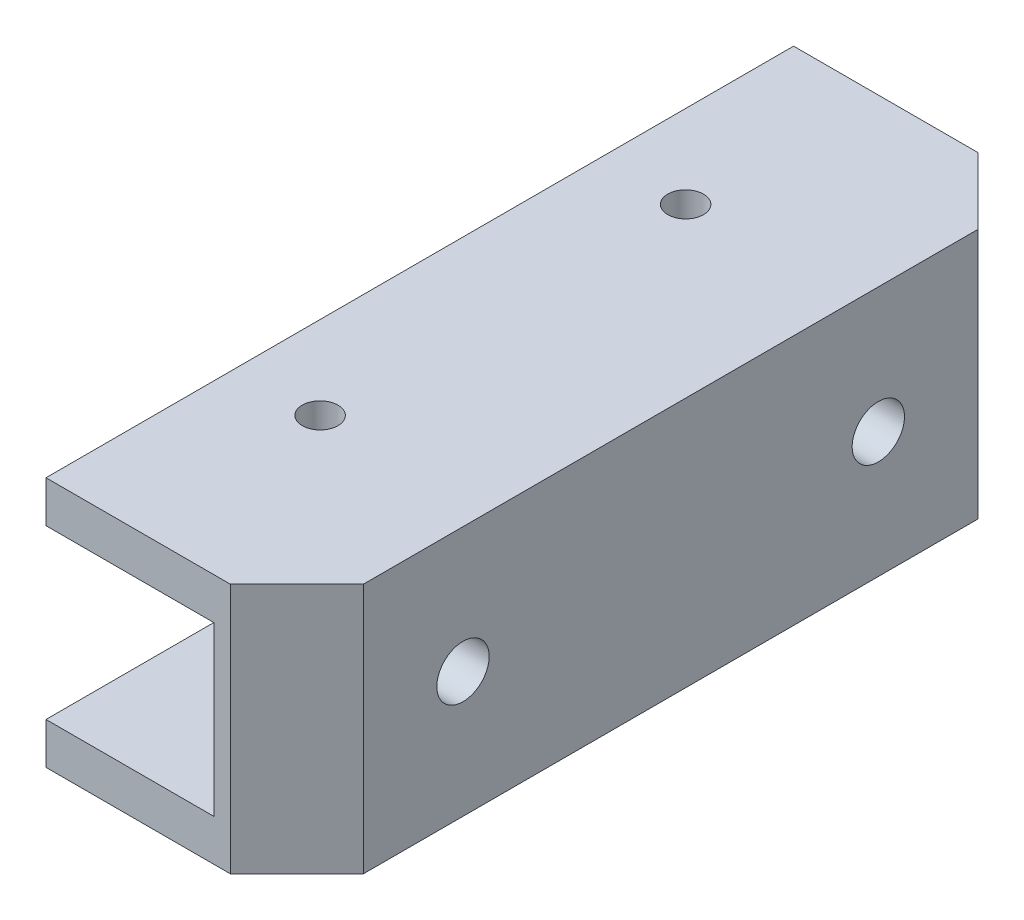
ISO-10303-21;
HEADER;
FILE_DESCRIPTION(('STEP AP214'),'2;1');
FILE_NAME('part.step','',(''),(''),'','','');
FILE_SCHEMA(('AUTOMOTIVE_DESIGN { 1 0 10303 214 1 1 1 1 }'));
ENDSEC;
DATA;
#1=APPLICATION_CONTEXT('core data for automotive mechanical design processes');
#2=APPLICATION_PROTOCOL_DEFINITION('international standard','automotive_design',2000,#1);
#3=PRODUCT_CONTEXT('',#1,'mechanical');
#4=PRODUCT('Part','Part','',(#3));
#5=PRODUCT_RELATED_PRODUCT_CATEGORY('part','',(#4));
#6=PRODUCT_DEFINITION_FORMATION('','',#4);
#7=PRODUCT_DEFINITION_CONTEXT('part definition',#1,'design');
#8=PRODUCT_DEFINITION('design','',#6,#7);
#9=PRODUCT_DEFINITION_SHAPE('','',#8);
#10=(LENGTH_UNIT() NAMED_UNIT(*) SI_UNIT(.MILLI.,.METRE.));
#11=(NAMED_UNIT(*) PLANE_ANGLE_UNIT() SI_UNIT($,.RADIAN.));
#12=(NAMED_UNIT(*) SI_UNIT($,.STERADIAN.) SOLID_ANGLE_UNIT());
#13=UNCERTAINTY_MEASURE_WITH_UNIT(LENGTH_MEASURE(1.E-05),#10,'distance_accuracy_value','');
#14=(GEOMETRIC_REPRESENTATION_CONTEXT(3) GLOBAL_UNCERTAINTY_ASSIGNED_CONTEXT((#13)) GLOBAL_UNIT_ASSIGNED_CONTEXT((#10,
#11,#12)) REPRESENTATION_CONTEXT('',''));
#15=CARTESIAN_POINT('',(0.,0.,0.));
#16=DIRECTION('',(0.,0.,1.));
#17=DIRECTION('',(1.,0.,0.));
#18=AXIS2_PLACEMENT_3D('',#15,#16,#17);
#19=CARTESIAN_POINT('',(-14.8,10.1,5.));
#20=DIRECTION('',(1.,0.,0.));
#21=DIRECTION('',(0.,1.,0.));
#22=AXIS2_PLACEMENT_3D('',#19,#20,#21);
#23=CYLINDRICAL_SURFACE('',#22,3.15);
#24=CARTESIAN_POINT('',(30.2,10.1,5.));
#25=DIRECTION('',(1.,0.,0.));
#26=DIRECTION('',(0.,1.,0.));
#27=AXIS2_PLACEMENT_3D('',#24,#25,#26);
#28=CIRCLE('',#27,3.15);
#29=CARTESIAN_POINT('',(30.2,13.25,5.));
#30=VERTEX_POINT('',#29);
#31=EDGE_CURVE('E226',#30,#30,#28,.T.);
#32=ORIENTED_EDGE('',*,*,#31,.T.);
#33=EDGE_LOOP('',(#32));
#34=FACE_BOUND('',#33,.T.);
#35=CARTESIAN_POINT('',(25.2,10.1,5.));
#36=DIRECTION('',(-1.,0.,0.));
#37=DIRECTION('',(0.,0.,1.));
#38=AXIS2_PLACEMENT_3D('',#35,#36,#37);
#39=CIRCLE('',#38,3.15);
#40=CARTESIAN_POINT('',(25.2,10.1,8.15));
#41=VERTEX_POINT('',#40);
#42=EDGE_CURVE('E43',#41,#41,#39,.F.);
#43=ORIENTED_EDGE('',*,*,#42,.F.);
#44=EDGE_LOOP('',(#43));
#45=FACE_BOUND('',#44,.T.);
#46=ADVANCED_FACE('F38',(#34,#45),#23,.F.);
#47=CARTESIAN_POINT('',(-14.8,10.1,55.));
#48=DIRECTION('',(1.,0.,0.));
#49=DIRECTION('',(0.,1.,0.));
#50=AXIS2_PLACEMENT_3D('',#47,#48,#49);
#51=CYLINDRICAL_SURFACE('',#50,3.15);
#52=CARTESIAN_POINT('',(30.2,10.1,55.));
#53=DIRECTION('',(1.,0.,0.));
#54=DIRECTION('',(0.,1.,0.));
#55=AXIS2_PLACEMENT_3D('',#52,#53,#54);
#56=CIRCLE('',#55,3.15);
#57=CARTESIAN_POINT('',(30.2,13.25,55.));
#58=VERTEX_POINT('',#57);
#59=EDGE_CURVE('E243',#58,#58,#56,.T.);
#60=ORIENTED_EDGE('',*,*,#59,.T.);
#61=EDGE_LOOP('',(#60));
#62=FACE_BOUND('',#61,.T.);
#63=CARTESIAN_POINT('',(25.2,10.1,55.));
#64=DIRECTION('',(-1.,0.,0.));
#65=DIRECTION('',(0.,0.,1.));
#66=AXIS2_PLACEMENT_3D('',#63,#64,#65);
#67=CIRCLE('',#66,3.15);
#68=CARTESIAN_POINT('',(25.2,10.1,58.15));
#69=VERTEX_POINT('',#68);
#70=EDGE_CURVE('E220',#69,#69,#67,.F.);
#71=ORIENTED_EDGE('',*,*,#70,.F.);
#72=EDGE_LOOP('',(#71));
#73=FACE_BOUND('',#72,.T.);
#74=ADVANCED_FACE('F287',(#62,#73),#51,.F.);
#75=CARTESIAN_POINT('',(0.,0.,60.));
#76=DIRECTION('',(0.,-1.,0.));
#77=DIRECTION('',(0.,0.,-1.));
#78=AXIS2_PLACEMENT_3D('',#75,#76,#77);
#79=PLANE('',#78);
#80=CARTESIAN_POINT('',(10.,0.,8.));
#81=DIRECTION('',(0.,-1.,0.));
#82=DIRECTION('',(0.,0.,-1.));
#83=AXIS2_PLACEMENT_3D('',#80,#81,#82);
#84=CIRCLE('',#83,2.15);
#85=CARTESIAN_POINT('',(10.,0.,5.85));
#86=VERTEX_POINT('',#85);
#87=EDGE_CURVE('E130',#86,#86,#84,.T.);
#88=ORIENTED_EDGE('',*,*,#87,.T.);
#89=EDGE_LOOP('',(#88));
#90=FACE_BOUND('',#89,.T.);
#91=CARTESIAN_POINT('',(10.,0.,52.));
#92=DIRECTION('',(0.,-1.,0.));
#93=DIRECTION('',(0.,0.,-1.));
#94=AXIS2_PLACEMENT_3D('',#91,#92,#93);
#95=CIRCLE('',#94,2.15);
#96=CARTESIAN_POINT('',(10.,0.,49.85));
#97=VERTEX_POINT('',#96);
#98=EDGE_CURVE('E186',#97,#97,#95,.T.);
#99=ORIENTED_EDGE('',*,*,#98,.T.);
#100=EDGE_LOOP('',(#99));
#101=FACE_BOUND('',#100,.T.);
#102=DIRECTION('',(0.,0.,-1.));
#103=VECTOR('',#102,1.);
#104=CARTESIAN_POINT('',(20.2,0.,60.));
#105=LINE('',#104,#103);
#106=CARTESIAN_POINT('',(20.2,0.,75.));
#107=VERTEX_POINT('',#106);
#108=CARTESIAN_POINT('',(20.2,0.,-15.));
#109=VERTEX_POINT('',#108);
#110=EDGE_CURVE('E119',#107,#109,#105,.T.);
#111=ORIENTED_EDGE('',*,*,#110,.T.);
#112=DIRECTION('',(1.,0.,0.));
#113=VECTOR('',#112,1.);
#114=CARTESIAN_POINT('',(0.,0.,-15.));
#115=LINE('',#114,#113);
#116=CARTESIAN_POINT('',(0.,0.,-15.));
#117=VERTEX_POINT('',#116);
#118=EDGE_CURVE('E163',#117,#109,#115,.T.);
#119=ORIENTED_EDGE('',*,*,#118,.F.);
#120=DIRECTION('',(0.,0.,-1.));
#121=VECTOR('',#120,1.);
#122=CARTESIAN_POINT('',(0.,0.,60.));
#123=LINE('',#122,#121);
#124=CARTESIAN_POINT('',(0.,0.,75.));
#125=VERTEX_POINT('',#124);
#126=EDGE_CURVE('E135',#125,#117,#123,.T.);
#127=ORIENTED_EDGE('',*,*,#126,.F.);
#128=DIRECTION('',(-1.,0.,0.));
#129=VECTOR('',#128,1.);
#130=CARTESIAN_POINT('',(20.2,0.,75.));
#131=LINE('',#130,#129);
#132=EDGE_CURVE('E133',#107,#125,#131,.T.);
#133=ORIENTED_EDGE('',*,*,#132,.F.);
#134=EDGE_LOOP('',(#111,#119,#127,#133));
#135=FACE_BOUND('',#134,.T.);
#136=ADVANCED_FACE('F134',(#90,#101,#135),#79,.F.);
#137=CARTESIAN_POINT('',(0.,0.,60.));
#138=DIRECTION('',(1.,0.,0.));
#139=DIRECTION('',(0.,1.,0.));
#140=AXIS2_PLACEMENT_3D('',#137,#138,#139);
#141=PLANE('',#140);
#142=ORIENTED_EDGE('',*,*,#126,.T.);
#143=DIRECTION('',(0.,1.,0.));
#144=VECTOR('',#143,1.);
#145=CARTESIAN_POINT('',(0.,-5.,-15.));
#146=LINE('',#145,#144);
#147=CARTESIAN_POINT('',(0.,-5.,-15.));
#148=VERTEX_POINT('',#147);
#149=EDGE_CURVE('E160',#148,#117,#146,.T.);
#150=ORIENTED_EDGE('',*,*,#149,.F.);
#151=DIRECTION('',(0.,0.,-1.));
#152=VECTOR('',#151,1.);
#153=CARTESIAN_POINT('',(0.,-5.,60.));
#154=LINE('',#153,#152);
#155=CARTESIAN_POINT('',(0.,-5.,75.));
#156=VERTEX_POINT('',#155);
#157=EDGE_CURVE('E200',#156,#148,#154,.T.);
#158=ORIENTED_EDGE('',*,*,#157,.F.);
#159=DIRECTION('',(0.,-1.,0.));
#160=VECTOR('',#159,1.);
#161=CARTESIAN_POINT('',(0.,0.,75.));
#162=LINE('',#161,#160);
#163=EDGE_CURVE('E138',#125,#156,#162,.T.);
#164=ORIENTED_EDGE('',*,*,#163,.F.);
#165=EDGE_LOOP('',(#142,#150,#158,#164));
#166=FACE_BOUND('',#165,.T.);
#167=ADVANCED_FACE('F263',(#166),#141,.F.);
#168=CARTESIAN_POINT('',(0.,-5.,60.));
#169=DIRECTION('',(0.,1.,0.));
#170=DIRECTION('',(0.,0.,1.));
#171=AXIS2_PLACEMENT_3D('',#168,#169,#170);
#172=PLANE('',#171);
#173=CARTESIAN_POINT('',(10.,-5.,8.));
#174=DIRECTION('',(0.,1.,0.));
#175=DIRECTION('',(0.,0.,1.));
#176=AXIS2_PLACEMENT_3D('',#173,#174,#175);
#177=CIRCLE('',#176,2.15);
#178=CARTESIAN_POINT('',(10.,-5.,10.15));
#179=VERTEX_POINT('',#178);
#180=EDGE_CURVE('E190',#179,#179,#177,.T.);
#181=ORIENTED_EDGE('',*,*,#180,.T.);
#182=EDGE_LOOP('',(#181));
#183=FACE_BOUND('',#182,.T.);
#184=CARTESIAN_POINT('',(10.,-5.,52.));
#185=DIRECTION('',(0.,1.,0.));
#186=DIRECTION('',(0.,0.,1.));
#187=AXIS2_PLACEMENT_3D('',#184,#185,#186);
#188=CIRCLE('',#187,2.15);
#189=CARTESIAN_POINT('',(10.,-5.,54.15));
#190=VERTEX_POINT('',#189);
#191=EDGE_CURVE('E183',#190,#190,#188,.T.);
#192=ORIENTED_EDGE('',*,*,#191,.T.);
#193=EDGE_LOOP('',(#192));
#194=FACE_BOUND('',#193,.T.);
#195=DIRECTION('',(0.,0.,-1.));
#196=VECTOR('',#195,1.);
#197=CARTESIAN_POINT('',(30.2,-5.,75.));
#198=LINE('',#197,#196);
#199=CARTESIAN_POINT('',(30.2,-5.,67.));
#200=VERTEX_POINT('',#199);
#201=CARTESIAN_POINT('',(30.2,-5.,-6.99999999999999));
#202=VERTEX_POINT('',#201);
#203=EDGE_CURVE('E148',#200,#202,#198,.T.);
#204=ORIENTED_EDGE('',*,*,#203,.F.);
#205=DIRECTION('',(-0.707106781186549,0.,0.707106781186546));
#206=VECTOR('',#205,1.);
#207=CARTESIAN_POINT('',(30.2,-5.,67.));
#208=LINE('',#207,#206);
#209=CARTESIAN_POINT('',(22.2,-5.,75.));
#210=VERTEX_POINT('',#209);
#211=EDGE_CURVE('E216',#200,#210,#208,.T.);
#212=ORIENTED_EDGE('',*,*,#211,.T.);
#213=DIRECTION('',(1.,0.,0.));
#214=VECTOR('',#213,1.);
#215=CARTESIAN_POINT('',(0.,-5.,75.));
#216=LINE('',#215,#214);
#217=EDGE_CURVE('E153',#156,#210,#216,.T.);
#218=ORIENTED_EDGE('',*,*,#217,.F.);
#219=ORIENTED_EDGE('',*,*,#157,.T.);
#220=DIRECTION('',(-1.,0.,0.));
#221=VECTOR('',#220,1.);
#222=CARTESIAN_POINT('',(25.2,-5.,-15.));
#223=LINE('',#222,#221);
#224=CARTESIAN_POINT('',(22.2,-5.,-15.));
#225=VERTEX_POINT('',#224);
#226=EDGE_CURVE('E174',#225,#148,#223,.T.);
#227=ORIENTED_EDGE('',*,*,#226,.F.);
#228=DIRECTION('',(-0.707106781186549,0.,-0.707106781186546));
#229=VECTOR('',#228,1.);
#230=CARTESIAN_POINT('',(30.2,-5.,-7.00000000000002));
#231=LINE('',#230,#229);
#232=EDGE_CURVE('E214',#225,#202,#231,.F.);
#233=ORIENTED_EDGE('',*,*,#232,.T.);
#234=EDGE_LOOP('',(#204,#212,#218,#219,#227,#233));
#235=FACE_BOUND('',#234,.T.);
#236=ADVANCED_FACE('F259',(#183,#194,#235),#172,.F.);
#237=CARTESIAN_POINT('',(0.,25.2,60.));
#238=DIRECTION('',(0.,-1.,0.));
#239=DIRECTION('',(0.,0.,-1.));
#240=AXIS2_PLACEMENT_3D('',#237,#238,#239);
#241=PLANE('',#240);
#242=CARTESIAN_POINT('',(10.,25.2,8.));
#243=DIRECTION('',(0.,1.,0.));
#244=DIRECTION('',(0.,0.,1.));
#245=AXIS2_PLACEMENT_3D('',#242,#243,#244);
#246=CIRCLE('',#245,2.15);
#247=CARTESIAN_POINT('',(10.,25.2,10.15));
#248=VERTEX_POINT('',#247);
#249=EDGE_CURVE('E177',#248,#248,#246,.T.);
#250=ORIENTED_EDGE('',*,*,#249,.F.);
#251=EDGE_LOOP('',(#250));
#252=FACE_BOUND('',#251,.T.);
#253=CARTESIAN_POINT('',(10.,25.2,52.));
#254=DIRECTION('',(0.,1.,0.));
#255=DIRECTION('',(0.,0.,1.));
#256=AXIS2_PLACEMENT_3D('',#253,#254,#255);
#257=CIRCLE('',#256,2.15);
#258=CARTESIAN_POINT('',(10.,25.2,54.15));
#259=VERTEX_POINT('',#258);
#260=EDGE_CURVE('E176',#259,#259,#257,.T.);
#261=ORIENTED_EDGE('',*,*,#260,.F.);
#262=EDGE_LOOP('',(#261));
#263=FACE_BOUND('',#262,.T.);
#264=DIRECTION('',(-1.,0.,0.));
#265=VECTOR('',#264,1.);
#266=CARTESIAN_POINT('',(25.2,25.2,75.));
#267=LINE('',#266,#265);
#268=CARTESIAN_POINT('',(22.2,25.2,75.));
#269=VERTEX_POINT('',#268);
#270=CARTESIAN_POINT('',(0.,25.2,75.));
#271=VERTEX_POINT('',#270);
#272=EDGE_CURVE('E155',#269,#271,#267,.T.);
#273=ORIENTED_EDGE('',*,*,#272,.F.);
#274=DIRECTION('',(0.707106781186549,0.,-0.707106781186546));
#275=VECTOR('',#274,1.);
#276=CARTESIAN_POINT('',(30.2,25.2,67.));
#277=LINE('',#276,#275);
#278=CARTESIAN_POINT('',(30.2,25.2,66.9999999999999));
#279=VERTEX_POINT('',#278);
#280=EDGE_CURVE('E48',#269,#279,#277,.T.);
#281=ORIENTED_EDGE('',*,*,#280,.T.);
#282=DIRECTION('',(0.,0.,1.));
#283=VECTOR('',#282,1.);
#284=CARTESIAN_POINT('',(30.2,25.2,-15.));
#285=LINE('',#284,#283);
#286=CARTESIAN_POINT('',(30.2,25.2,-7.00000000000002));
#287=VERTEX_POINT('',#286);
#288=EDGE_CURVE('E145',#287,#279,#285,.T.);
#289=ORIENTED_EDGE('',*,*,#288,.F.);
#290=DIRECTION('',(0.707106781186549,0.,0.707106781186546));
#291=VECTOR('',#290,1.);
#292=CARTESIAN_POINT('',(30.2,25.2,-7.00000000000002));
#293=LINE('',#292,#291);
#294=CARTESIAN_POINT('',(22.2,25.2,-15.));
#295=VERTEX_POINT('',#294);
#296=EDGE_CURVE('E56',#287,#295,#293,.F.);
#297=ORIENTED_EDGE('',*,*,#296,.T.);
#298=DIRECTION('',(1.,0.,0.));
#299=VECTOR('',#298,1.);
#300=CARTESIAN_POINT('',(0.,25.2,-15.));
#301=LINE('',#300,#299);
#302=CARTESIAN_POINT('',(0.,25.2,-15.));
#303=VERTEX_POINT('',#302);
#304=EDGE_CURVE('E172',#303,#295,#301,.T.);
#305=ORIENTED_EDGE('',*,*,#304,.F.);
#306=DIRECTION('',(0.,0.,-1.));
#307=VECTOR('',#306,1.);
#308=CARTESIAN_POINT('',(0.,25.2,60.));
#309=LINE('',#308,#307);
#310=EDGE_CURVE('E198',#271,#303,#309,.T.);
#311=ORIENTED_EDGE('',*,*,#310,.F.);
#312=EDGE_LOOP('',(#273,#281,#289,#297,#305,#311));
#313=FACE_BOUND('',#312,.T.);
#314=ADVANCED_FACE('F273',(#252,#263,#313),#241,.F.);
#315=CARTESIAN_POINT('',(0.,25.2,60.));
#316=DIRECTION('',(1.,0.,0.));
#317=DIRECTION('',(0.,1.,0.));
#318=AXIS2_PLACEMENT_3D('',#315,#316,#317);
#319=PLANE('',#318);
#320=ORIENTED_EDGE('',*,*,#310,.T.);
#321=DIRECTION('',(0.,1.,0.));
#322=VECTOR('',#321,1.);
#323=CARTESIAN_POINT('',(0.,20.2,-15.));
#324=LINE('',#323,#322);
#325=CARTESIAN_POINT('',(0.,20.2,-15.));
#326=VERTEX_POINT('',#325);
#327=EDGE_CURVE('E169',#326,#303,#324,.T.);
#328=ORIENTED_EDGE('',*,*,#327,.F.);
#329=DIRECTION('',(0.,0.,-1.));
#330=VECTOR('',#329,1.);
#331=CARTESIAN_POINT('',(0.,20.2,60.));
#332=LINE('',#331,#330);
#333=CARTESIAN_POINT('',(0.,20.2,75.));
#334=VERTEX_POINT('',#333);
#335=EDGE_CURVE('E196',#334,#326,#332,.T.);
#336=ORIENTED_EDGE('',*,*,#335,.F.);
#337=DIRECTION('',(0.,-1.,0.));
#338=VECTOR('',#337,1.);
#339=CARTESIAN_POINT('',(0.,25.2,75.));
#340=LINE('',#339,#338);
#341=EDGE_CURVE('E157',#271,#334,#340,.T.);
#342=ORIENTED_EDGE('',*,*,#341,.F.);
#343=EDGE_LOOP('',(#320,#328,#336,#342));
#344=FACE_BOUND('',#343,.T.);
#345=ADVANCED_FACE('F270',(#344),#319,.F.);
#346=CARTESIAN_POINT('',(0.,20.2,60.));
#347=DIRECTION('',(0.,1.,0.));
#348=DIRECTION('',(0.,0.,1.));
#349=AXIS2_PLACEMENT_3D('',#346,#347,#348);
#350=PLANE('',#349);
#351=CARTESIAN_POINT('',(10.,20.2,8.));
#352=DIRECTION('',(0.,1.,0.));
#353=DIRECTION('',(0.,0.,1.));
#354=AXIS2_PLACEMENT_3D('',#351,#352,#353);
#355=CIRCLE('',#354,2.15);
#356=CARTESIAN_POINT('',(10.,20.2,10.15));
#357=VERTEX_POINT('',#356);
#358=EDGE_CURVE('E189',#357,#357,#355,.T.);
#359=ORIENTED_EDGE('',*,*,#358,.T.);
#360=EDGE_LOOP('',(#359));
#361=FACE_BOUND('',#360,.T.);
#362=CARTESIAN_POINT('',(10.,20.2,52.));
#363=DIRECTION('',(0.,1.,0.));
#364=DIRECTION('',(0.,0.,1.));
#365=AXIS2_PLACEMENT_3D('',#362,#363,#364);
#366=CIRCLE('',#365,2.15);
#367=CARTESIAN_POINT('',(10.,20.2,54.15));
#368=VERTEX_POINT('',#367);
#369=EDGE_CURVE('E180',#368,#368,#366,.T.);
#370=ORIENTED_EDGE('',*,*,#369,.T.);
#371=EDGE_LOOP('',(#370));
#372=FACE_BOUND('',#371,.T.);
#373=ORIENTED_EDGE('',*,*,#335,.T.);
#374=DIRECTION('',(-1.,0.,0.));
#375=VECTOR('',#374,1.);
#376=CARTESIAN_POINT('',(20.2,20.2,-15.));
#377=LINE('',#376,#375);
#378=CARTESIAN_POINT('',(20.2,20.2,-15.));
#379=VERTEX_POINT('',#378);
#380=EDGE_CURVE('E166',#379,#326,#377,.T.);
#381=ORIENTED_EDGE('',*,*,#380,.F.);
#382=DIRECTION('',(0.,0.,-1.));
#383=VECTOR('',#382,1.);
#384=CARTESIAN_POINT('',(20.2,20.2,60.));
#385=LINE('',#384,#383);
#386=CARTESIAN_POINT('',(20.2,20.2,75.));
#387=VERTEX_POINT('',#386);
#388=EDGE_CURVE('E129',#387,#379,#385,.T.);
#389=ORIENTED_EDGE('',*,*,#388,.F.);
#390=DIRECTION('',(1.,0.,0.));
#391=VECTOR('',#390,1.);
#392=CARTESIAN_POINT('',(0.,20.2,75.));
#393=LINE('',#392,#391);
#394=EDGE_CURVE('E144',#334,#387,#393,.T.);
#395=ORIENTED_EDGE('',*,*,#394,.F.);
#396=EDGE_LOOP('',(#373,#381,#389,#395));
#397=FACE_BOUND('',#396,.T.);
#398=ADVANCED_FACE('F267',(#361,#372,#397),#350,.F.);
#399=CARTESIAN_POINT('',(20.2,0.,60.));
#400=DIRECTION('',(1.,0.,0.));
#401=DIRECTION('',(0.,0.,-1.));
#402=AXIS2_PLACEMENT_3D('',#399,#400,#401);
#403=PLANE('',#402);
#404=CARTESIAN_POINT('',(20.2,10.1,5.));
#405=DIRECTION('',(-1.,0.,0.));
#406=DIRECTION('',(0.,0.,1.));
#407=AXIS2_PLACEMENT_3D('',#404,#405,#406);
#408=CIRCLE('',#407,7.5);
#409=CARTESIAN_POINT('',(20.2,10.1,12.5));
#410=VERTEX_POINT('',#409);
#411=EDGE_CURVE('E228',#410,#410,#408,.T.);
#412=ORIENTED_EDGE('',*,*,#411,.F.);
#413=EDGE_LOOP('',(#412));
#414=FACE_BOUND('',#413,.T.);
#415=CARTESIAN_POINT('',(20.2,10.1,55.));
#416=DIRECTION('',(-1.,0.,0.));
#417=DIRECTION('',(0.,0.,1.));
#418=AXIS2_PLACEMENT_3D('',#415,#416,#417);
#419=CIRCLE('',#418,7.5);
#420=CARTESIAN_POINT('',(20.2,10.1,62.5));
#421=VERTEX_POINT('',#420);
#422=EDGE_CURVE('E238',#421,#421,#419,.T.);
#423=ORIENTED_EDGE('',*,*,#422,.F.);
#424=EDGE_LOOP('',(#423));
#425=FACE_BOUND('',#424,.T.);
#426=ORIENTED_EDGE('',*,*,#388,.T.);
#427=DIRECTION('',(0.,1.,0.));
#428=VECTOR('',#427,1.);
#429=CARTESIAN_POINT('',(20.2,0.,-15.));
#430=LINE('',#429,#428);
#431=EDGE_CURVE('E125',#109,#379,#430,.T.);
#432=ORIENTED_EDGE('',*,*,#431,.F.);
#433=ORIENTED_EDGE('',*,*,#110,.F.);
#434=DIRECTION('',(0.,-1.,0.));
#435=VECTOR('',#434,1.);
#436=CARTESIAN_POINT('',(20.2,20.2,75.));
#437=LINE('',#436,#435);
#438=EDGE_CURVE('E123',#387,#107,#437,.T.);
#439=ORIENTED_EDGE('',*,*,#438,.F.);
#440=EDGE_LOOP('',(#426,#432,#433,#439));
#441=FACE_BOUND('',#440,.T.);
#442=ADVANCED_FACE('F121',(#414,#425,#441),#403,.F.);
#443=CARTESIAN_POINT('',(10.,-14.8,52.));
#444=DIRECTION('',(0.,1.,0.));
#445=DIRECTION('',(0.,0.,1.));
#446=AXIS2_PLACEMENT_3D('',#443,#444,#445);
#447=CYLINDRICAL_SURFACE('',#446,2.15);
#448=ORIENTED_EDGE('',*,*,#260,.T.);
#449=EDGE_LOOP('',(#448));
#450=FACE_BOUND('',#449,.T.);
#451=ORIENTED_EDGE('',*,*,#369,.F.);
#452=EDGE_LOOP('',(#451));
#453=FACE_BOUND('',#452,.T.);
#454=ADVANCED_FACE('F307',(#450,#453),#447,.F.);
#455=CARTESIAN_POINT('',(10.,-14.8,8.));
#456=DIRECTION('',(0.,1.,0.));
#457=DIRECTION('',(0.,0.,1.));
#458=AXIS2_PLACEMENT_3D('',#455,#456,#457);
#459=CYLINDRICAL_SURFACE('',#458,2.15);
#460=ORIENTED_EDGE('',*,*,#249,.T.);
#461=EDGE_LOOP('',(#460));
#462=FACE_BOUND('',#461,.T.);
#463=ORIENTED_EDGE('',*,*,#358,.F.);
#464=EDGE_LOOP('',(#463));
#465=FACE_BOUND('',#464,.T.);
#466=ADVANCED_FACE('F303',(#462,#465),#459,.F.);
#467=ORIENTED_EDGE('',*,*,#191,.F.);
#468=EDGE_LOOP('',(#467));
#469=FACE_BOUND('',#468,.T.);
#470=ORIENTED_EDGE('',*,*,#98,.F.);
#471=EDGE_LOOP('',(#470));
#472=FACE_BOUND('',#471,.T.);
#473=ADVANCED_FACE('F301',(#469,#472),#447,.F.);
#474=ORIENTED_EDGE('',*,*,#180,.F.);
#475=EDGE_LOOP('',(#474));
#476=FACE_BOUND('',#475,.T.);
#477=ORIENTED_EDGE('',*,*,#87,.F.);
#478=EDGE_LOOP('',(#477));
#479=FACE_BOUND('',#478,.T.);
#480=ADVANCED_FACE('F298',(#476,#479),#459,.F.);
#481=CARTESIAN_POINT('',(0.,0.,-15.));
#482=DIRECTION('',(0.,0.,-1.));
#483=DIRECTION('',(-1.,0.,0.));
#484=AXIS2_PLACEMENT_3D('',#481,#482,#483);
#485=PLANE('',#484);
#486=ORIENTED_EDGE('',*,*,#304,.T.);
#487=DIRECTION('',(0.,-1.,0.));
#488=VECTOR('',#487,1.);
#489=CARTESIAN_POINT('',(22.2,0.,-15.));
#490=LINE('',#489,#488);
#491=EDGE_CURVE('E11',#295,#225,#490,.T.);
#492=ORIENTED_EDGE('',*,*,#491,.T.);
#493=ORIENTED_EDGE('',*,*,#226,.T.);
#494=ORIENTED_EDGE('',*,*,#149,.T.);
#495=ORIENTED_EDGE('',*,*,#118,.T.);
#496=ORIENTED_EDGE('',*,*,#431,.T.);
#497=ORIENTED_EDGE('',*,*,#380,.T.);
#498=ORIENTED_EDGE('',*,*,#327,.T.);
#499=EDGE_LOOP('',(#486,#492,#493,#494,#495,#496,#497,#498));
#500=FACE_BOUND('',#499,.T.);
#501=ADVANCED_FACE('F258',(#500),#485,.T.);
#502=CARTESIAN_POINT('',(0.,0.,75.));
#503=DIRECTION('',(0.,0.,-1.));
#504=DIRECTION('',(-1.,0.,0.));
#505=AXIS2_PLACEMENT_3D('',#502,#503,#504);
#506=PLANE('',#505);
#507=ORIENTED_EDGE('',*,*,#217,.T.);
#508=DIRECTION('',(0.,1.,0.));
#509=VECTOR('',#508,1.);
#510=CARTESIAN_POINT('',(22.2,25.2,75.));
#511=LINE('',#510,#509);
#512=EDGE_CURVE('E64',#210,#269,#511,.T.);
#513=ORIENTED_EDGE('',*,*,#512,.T.);
#514=ORIENTED_EDGE('',*,*,#272,.T.);
#515=ORIENTED_EDGE('',*,*,#341,.T.);
#516=ORIENTED_EDGE('',*,*,#394,.T.);
#517=ORIENTED_EDGE('',*,*,#438,.T.);
#518=ORIENTED_EDGE('',*,*,#132,.T.);
#519=ORIENTED_EDGE('',*,*,#163,.T.);
#520=EDGE_LOOP('',(#507,#513,#514,#515,#516,#517,#518,#519));
#521=FACE_BOUND('',#520,.T.);
#522=ADVANCED_FACE('F141',(#521),#506,.F.);
#523=CARTESIAN_POINT('',(30.2,0.,0.));
#524=DIRECTION('',(1.,0.,0.));
#525=DIRECTION('',(0.,1.,0.));
#526=AXIS2_PLACEMENT_3D('',#523,#524,#525);
#527=PLANE('',#526);
#528=ORIENTED_EDGE('',*,*,#59,.F.);
#529=EDGE_LOOP('',(#528));
#530=FACE_BOUND('',#529,.T.);
#531=ORIENTED_EDGE('',*,*,#288,.T.);
#532=DIRECTION('',(0.,-1.,0.));
#533=VECTOR('',#532,1.);
#534=CARTESIAN_POINT('',(30.2,-5.,67.));
#535=LINE('',#534,#533);
#536=EDGE_CURVE('E211',#279,#200,#535,.T.);
#537=ORIENTED_EDGE('',*,*,#536,.T.);
#538=ORIENTED_EDGE('',*,*,#203,.T.);
#539=DIRECTION('',(0.,1.,0.));
#540=VECTOR('',#539,1.);
#541=CARTESIAN_POINT('',(30.2,0.,-7.00000000000002));
#542=LINE('',#541,#540);
#543=EDGE_CURVE('E204',#202,#287,#542,.T.);
#544=ORIENTED_EDGE('',*,*,#543,.T.);
#545=EDGE_LOOP('',(#531,#537,#538,#544));
#546=FACE_BOUND('',#545,.T.);
#547=ORIENTED_EDGE('',*,*,#31,.F.);
#548=EDGE_LOOP('',(#547));
#549=FACE_BOUND('',#548,.T.);
#550=ADVANCED_FACE('F249',(#530,#546,#549),#527,.T.);
#551=CARTESIAN_POINT('',(30.2,0.,67.));
#552=DIRECTION('',(0.707106781186546,0.,0.707106781186549));
#553=DIRECTION('',(0.,1.,0.));
#554=AXIS2_PLACEMENT_3D('',#551,#552,#553);
#555=PLANE('',#554);
#556=ORIENTED_EDGE('',*,*,#280,.F.);
#557=ORIENTED_EDGE('',*,*,#512,.F.);
#558=ORIENTED_EDGE('',*,*,#211,.F.);
#559=ORIENTED_EDGE('',*,*,#536,.F.);
#560=EDGE_LOOP('',(#556,#557,#558,#559));
#561=FACE_BOUND('',#560,.T.);
#562=ADVANCED_FACE('F355',(#561),#555,.T.);
#563=CARTESIAN_POINT('',(30.2,0.,-7.00000000000002));
#564=DIRECTION('',(-0.707106781186546,0.,0.707106781186549));
#565=DIRECTION('',(0.,1.,0.));
#566=AXIS2_PLACEMENT_3D('',#563,#564,#565);
#567=PLANE('',#566);
#568=ORIENTED_EDGE('',*,*,#232,.F.);
#569=ORIENTED_EDGE('',*,*,#491,.F.);
#570=ORIENTED_EDGE('',*,*,#296,.F.);
#571=ORIENTED_EDGE('',*,*,#543,.F.);
#572=EDGE_LOOP('',(#568,#569,#570,#571));
#573=FACE_BOUND('',#572,.T.);
#574=ADVANCED_FACE('F41',(#573),#567,.F.);
#575=CARTESIAN_POINT('',(25.2,10.1,55.));
#576=DIRECTION('',(-1.,0.,0.));
#577=DIRECTION('',(0.,0.,1.));
#578=AXIS2_PLACEMENT_3D('',#575,#576,#577);
#579=PLANE('',#578);
#580=CARTESIAN_POINT('',(25.2,10.1,55.));
#581=DIRECTION('',(-1.,0.,0.));
#582=DIRECTION('',(0.,0.,1.));
#583=AXIS2_PLACEMENT_3D('',#580,#581,#582);
#584=CIRCLE('',#583,7.5);
#585=CARTESIAN_POINT('',(25.2,10.1,62.5));
#586=VERTEX_POINT('',#585);
#587=EDGE_CURVE('E233',#586,#586,#584,.T.);
#588=ORIENTED_EDGE('',*,*,#587,.T.);
#589=EDGE_LOOP('',(#588));
#590=FACE_BOUND('',#589,.T.);
#591=ORIENTED_EDGE('',*,*,#70,.T.);
#592=EDGE_LOOP('',(#591));
#593=FACE_BOUND('',#592,.T.);
#594=ADVANCED_FACE('F369',(#590,#593),#579,.T.);
#595=CARTESIAN_POINT('',(25.2,10.1,55.));
#596=DIRECTION('',(-1.,0.,0.));
#597=DIRECTION('',(0.,0.,1.));
#598=AXIS2_PLACEMENT_3D('',#595,#596,#597);
#599=CYLINDRICAL_SURFACE('',#598,7.5);
#600=ORIENTED_EDGE('',*,*,#587,.F.);
#601=EDGE_LOOP('',(#600));
#602=FACE_BOUND('',#601,.T.);
#603=ORIENTED_EDGE('',*,*,#422,.T.);
#604=EDGE_LOOP('',(#603));
#605=FACE_BOUND('',#604,.T.);
#606=ADVANCED_FACE('F375',(#602,#605),#599,.F.);
#607=CARTESIAN_POINT('',(25.2,10.1,5.));
#608=DIRECTION('',(-1.,0.,0.));
#609=DIRECTION('',(0.,0.,1.));
#610=AXIS2_PLACEMENT_3D('',#607,#608,#609);
#611=PLANE('',#610);
#612=CARTESIAN_POINT('',(25.2,10.1,5.));
#613=DIRECTION('',(-1.,0.,0.));
#614=DIRECTION('',(0.,0.,1.));
#615=AXIS2_PLACEMENT_3D('',#612,#613,#614);
#616=CIRCLE('',#615,7.5);
#617=CARTESIAN_POINT('',(25.2,10.1,12.5));
#618=VERTEX_POINT('',#617);
#619=EDGE_CURVE('E222',#618,#618,#616,.T.);
#620=ORIENTED_EDGE('',*,*,#619,.T.);
#621=EDGE_LOOP('',(#620));
#622=FACE_BOUND('',#621,.T.);
#623=ORIENTED_EDGE('',*,*,#42,.T.);
#624=EDGE_LOOP('',(#623));
#625=FACE_BOUND('',#624,.T.);
#626=ADVANCED_FACE('F384',(#622,#625),#611,.T.);
#627=CARTESIAN_POINT('',(25.2,10.1,5.));
#628=DIRECTION('',(-1.,0.,0.));
#629=DIRECTION('',(0.,0.,1.));
#630=AXIS2_PLACEMENT_3D('',#627,#628,#629);
#631=CYLINDRICAL_SURFACE('',#630,7.5);
#632=ORIENTED_EDGE('',*,*,#619,.F.);
#633=EDGE_LOOP('',(#632));
#634=FACE_BOUND('',#633,.T.);
#635=ORIENTED_EDGE('',*,*,#411,.T.);
#636=EDGE_LOOP('',(#635));
#637=FACE_BOUND('',#636,.T.);
#638=ADVANCED_FACE('F392',(#634,#637),#631,.F.);
#639=CLOSED_SHELL('',(#46,#74,#136,#167,#236,#314,#345,#398,#442,#454,#466,#473,#480,#501,#522,
#550,#562,#574,#594,#606,#626,#638));
#640=MANIFOLD_SOLID_BREP('B2',#639);
#641=ADVANCED_BREP_SHAPE_REPRESENTATION('',(#18,#640),#14);
#642=SHAPE_DEFINITION_REPRESENTATION(#9,#641);
ENDSEC;
END-ISO-10303-21;
